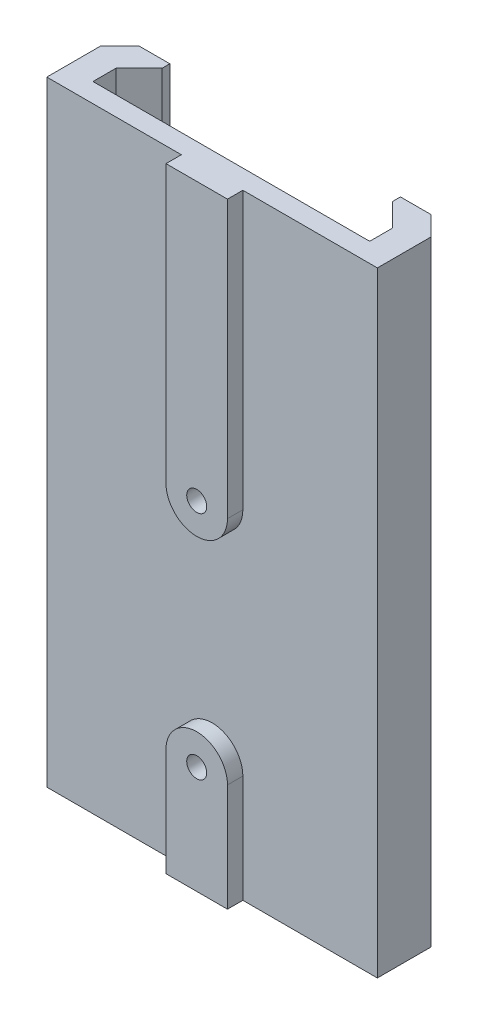
ISO-10303-21;
HEADER;
FILE_DESCRIPTION(('STEP AP214'),'2;1');
FILE_NAME('part.step','',(''),(''),'','','');
FILE_SCHEMA(('AUTOMOTIVE_DESIGN { 1 0 10303 214 1 1 1 1 }'));
ENDSEC;
DATA;
#1=APPLICATION_CONTEXT('core data for automotive mechanical design processes');
#2=APPLICATION_PROTOCOL_DEFINITION('international standard','automotive_design',2000,#1);
#3=PRODUCT_CONTEXT('',#1,'mechanical');
#4=PRODUCT('Part','Part','',(#3));
#5=PRODUCT_RELATED_PRODUCT_CATEGORY('part','',(#4));
#6=PRODUCT_DEFINITION_FORMATION('','',#4);
#7=PRODUCT_DEFINITION_CONTEXT('part definition',#1,'design');
#8=PRODUCT_DEFINITION('design','',#6,#7);
#9=PRODUCT_DEFINITION_SHAPE('','',#8);
#10=(LENGTH_UNIT() NAMED_UNIT(*) SI_UNIT(.MILLI.,.METRE.));
#11=(NAMED_UNIT(*) PLANE_ANGLE_UNIT() SI_UNIT($,.RADIAN.));
#12=(NAMED_UNIT(*) SI_UNIT($,.STERADIAN.) SOLID_ANGLE_UNIT());
#13=UNCERTAINTY_MEASURE_WITH_UNIT(LENGTH_MEASURE(1.E-05),#10,'distance_accuracy_value','');
#14=(GEOMETRIC_REPRESENTATION_CONTEXT(3) GLOBAL_UNCERTAINTY_ASSIGNED_CONTEXT((#13)) GLOBAL_UNIT_ASSIGNED_CONTEXT((#10,
#11,#12)) REPRESENTATION_CONTEXT('',''));
#15=CARTESIAN_POINT('',(0.,0.,0.));
#16=DIRECTION('',(0.,0.,1.));
#17=DIRECTION('',(1.,0.,0.));
#18=AXIS2_PLACEMENT_3D('',#15,#16,#17);
#19=CARTESIAN_POINT('',(21.5,-36.,0.));
#20=DIRECTION('',(0.,0.,1.));
#21=DIRECTION('',(1.,0.,0.));
#22=AXIS2_PLACEMENT_3D('',#19,#20,#21);
#23=CYLINDRICAL_SURFACE('',#22,1.3);
#24=CARTESIAN_POINT('',(21.5,-36.,11.5));
#25=DIRECTION('',(0.,0.,1.));
#26=DIRECTION('',(1.,0.,0.));
#27=AXIS2_PLACEMENT_3D('',#24,#25,#26);
#28=CIRCLE('',#27,1.3);
#29=CARTESIAN_POINT('',(22.8,-36.,11.5));
#30=VERTEX_POINT('',#29);
#31=EDGE_CURVE('E436',#30,#30,#28,.T.);
#32=ORIENTED_EDGE('',*,*,#31,.T.);
#33=EDGE_LOOP('',(#32));
#34=FACE_BOUND('',#33,.T.);
#35=CARTESIAN_POINT('',(21.5,-36.,8.8));
#36=DIRECTION('',(0.,0.,-1.));
#37=DIRECTION('',(-1.,0.,0.));
#38=AXIS2_PLACEMENT_3D('',#35,#36,#37);
#39=CIRCLE('',#38,1.3);
#40=CARTESIAN_POINT('',(20.2,-36.,8.8));
#41=VERTEX_POINT('',#40);
#42=EDGE_CURVE('E304',#41,#41,#39,.F.);
#43=ORIENTED_EDGE('',*,*,#42,.F.);
#44=EDGE_LOOP('',(#43));
#45=FACE_BOUND('',#44,.T.);
#46=ADVANCED_FACE('F37',(#34,#45),#23,.F.);
#47=CARTESIAN_POINT('',(21.5,-66.,0.));
#48=DIRECTION('',(0.,0.,1.));
#49=DIRECTION('',(1.,0.,0.));
#50=AXIS2_PLACEMENT_3D('',#47,#48,#49);
#51=CYLINDRICAL_SURFACE('',#50,1.3);
#52=CARTESIAN_POINT('',(21.5,-66.,11.5));
#53=DIRECTION('',(0.,0.,1.));
#54=DIRECTION('',(1.,0.,0.));
#55=AXIS2_PLACEMENT_3D('',#52,#53,#54);
#56=CIRCLE('',#55,1.3);
#57=CARTESIAN_POINT('',(22.8,-66.,11.5));
#58=VERTEX_POINT('',#57);
#59=EDGE_CURVE('E307',#58,#58,#56,.T.);
#60=ORIENTED_EDGE('',*,*,#59,.T.);
#61=EDGE_LOOP('',(#60));
#62=FACE_BOUND('',#61,.T.);
#63=CARTESIAN_POINT('',(21.5,-66.,8.8));
#64=DIRECTION('',(0.,0.,-1.));
#65=DIRECTION('',(-1.,0.,0.));
#66=AXIS2_PLACEMENT_3D('',#63,#64,#65);
#67=CIRCLE('',#66,1.3);
#68=CARTESIAN_POINT('',(20.2,-66.,8.8));
#69=VERTEX_POINT('',#68);
#70=EDGE_CURVE('E301',#69,#69,#67,.F.);
#71=ORIENTED_EDGE('',*,*,#70,.F.);
#72=EDGE_LOOP('',(#71));
#73=FACE_BOUND('',#72,.T.);
#74=ADVANCED_FACE('F519',(#62,#73),#51,.F.);
#75=CARTESIAN_POINT('',(0.,0.,9.5));
#76=DIRECTION('',(0.,0.,1.));
#77=DIRECTION('',(1.,0.,0.));
#78=AXIS2_PLACEMENT_3D('',#75,#76,#77);
#79=PLANE('',#78);
#80=DIRECTION('',(-1.,0.,0.));
#81=VECTOR('',#80,1.);
#82=CARTESIAN_POINT('',(0.,0.,9.5));
#83=LINE('',#82,#81);
#84=CARTESIAN_POINT('',(43.,0.,9.5));
#85=VERTEX_POINT('',#84);
#86=CARTESIAN_POINT('',(25.5,0.,9.5));
#87=VERTEX_POINT('',#86);
#88=EDGE_CURVE('E264',#85,#87,#83,.T.);
#89=ORIENTED_EDGE('',*,*,#88,.T.);
#90=DIRECTION('',(0.,1.,0.));
#91=VECTOR('',#90,1.);
#92=CARTESIAN_POINT('',(25.5,0.,9.5));
#93=LINE('',#92,#91);
#94=CARTESIAN_POINT('',(25.5,-36.,9.5));
#95=VERTEX_POINT('',#94);
#96=EDGE_CURVE('E431',#95,#87,#93,.T.);
#97=ORIENTED_EDGE('',*,*,#96,.F.);
#98=CARTESIAN_POINT('',(21.5,-36.,9.5));
#99=DIRECTION('',(0.,0.,1.));
#100=DIRECTION('',(1.,0.,0.));
#101=AXIS2_PLACEMENT_3D('',#98,#99,#100);
#102=CIRCLE('',#101,4.);
#103=CARTESIAN_POINT('',(17.5,-36.,9.5));
#104=VERTEX_POINT('',#103);
#105=EDGE_CURVE('E433',#104,#95,#102,.T.);
#106=ORIENTED_EDGE('',*,*,#105,.F.);
#107=DIRECTION('',(0.,-1.,0.));
#108=VECTOR('',#107,1.);
#109=CARTESIAN_POINT('',(17.5,-36.,9.5));
#110=LINE('',#109,#108);
#111=CARTESIAN_POINT('',(17.5,0.,9.5));
#112=VERTEX_POINT('',#111);
#113=EDGE_CURVE('E428',#112,#104,#110,.T.);
#114=ORIENTED_EDGE('',*,*,#113,.F.);
#115=CARTESIAN_POINT('',(0.,0.,9.5));
#116=VERTEX_POINT('',#115);
#117=EDGE_CURVE('E263',#112,#116,#83,.T.);
#118=ORIENTED_EDGE('',*,*,#117,.T.);
#119=DIRECTION('',(0.,-1.,0.));
#120=VECTOR('',#119,1.);
#121=CARTESIAN_POINT('',(0.,0.,9.5));
#122=LINE('',#121,#120);
#123=CARTESIAN_POINT('',(0.,-80.,9.5));
#124=VERTEX_POINT('',#123);
#125=EDGE_CURVE('E254',#116,#124,#122,.T.);
#126=ORIENTED_EDGE('',*,*,#125,.T.);
#127=DIRECTION('',(1.,0.,0.));
#128=VECTOR('',#127,1.);
#129=CARTESIAN_POINT('',(0.,-80.,9.5));
#130=LINE('',#129,#128);
#131=CARTESIAN_POINT('',(17.5,-80.,9.5));
#132=VERTEX_POINT('',#131);
#133=EDGE_CURVE('E259',#124,#132,#130,.T.);
#134=ORIENTED_EDGE('',*,*,#133,.T.);
#135=DIRECTION('',(0.,-1.,0.));
#136=VECTOR('',#135,1.);
#137=CARTESIAN_POINT('',(17.5,-66.,9.5));
#138=LINE('',#137,#136);
#139=CARTESIAN_POINT('',(17.5,-66.,9.5));
#140=VERTEX_POINT('',#139);
#141=EDGE_CURVE('E408',#140,#132,#138,.T.);
#142=ORIENTED_EDGE('',*,*,#141,.F.);
#143=CARTESIAN_POINT('',(21.5,-66.,9.5));
#144=DIRECTION('',(0.,0.,1.));
#145=DIRECTION('',(-1.,0.,0.));
#146=AXIS2_PLACEMENT_3D('',#143,#144,#145);
#147=CIRCLE('',#146,4.);
#148=CARTESIAN_POINT('',(25.5,-66.,9.5));
#149=VERTEX_POINT('',#148);
#150=EDGE_CURVE('E401',#149,#140,#147,.T.);
#151=ORIENTED_EDGE('',*,*,#150,.F.);
#152=DIRECTION('',(0.,1.,0.));
#153=VECTOR('',#152,1.);
#154=CARTESIAN_POINT('',(25.5,-66.,9.5));
#155=LINE('',#154,#153);
#156=CARTESIAN_POINT('',(25.5,-80.,9.5));
#157=VERTEX_POINT('',#156);
#158=EDGE_CURVE('E405',#157,#149,#155,.T.);
#159=ORIENTED_EDGE('',*,*,#158,.F.);
#160=CARTESIAN_POINT('',(43.,-80.,9.5));
#161=VERTEX_POINT('',#160);
#162=EDGE_CURVE('E257',#157,#161,#130,.T.);
#163=ORIENTED_EDGE('',*,*,#162,.T.);
#164=DIRECTION('',(0.,1.,0.));
#165=VECTOR('',#164,1.);
#166=CARTESIAN_POINT('',(43.,0.,9.5));
#167=LINE('',#166,#165);
#168=EDGE_CURVE('E261',#161,#85,#167,.T.);
#169=ORIENTED_EDGE('',*,*,#168,.T.);
#170=EDGE_LOOP('',(#89,#97,#106,#114,#118,#126,#134,#142,#151,#159,#163,#169));
#171=FACE_BOUND('',#170,.T.);
#172=ADVANCED_FACE('F525',(#171),#79,.T.);
#173=CARTESIAN_POINT('',(0.,0.,0.));
#174=DIRECTION('',(0.,0.,1.));
#175=DIRECTION('',(1.,0.,0.));
#176=AXIS2_PLACEMENT_3D('',#173,#174,#175);
#177=PLANE('',#176);
#178=DIRECTION('',(-1.,0.,0.));
#179=VECTOR('',#178,1.);
#180=CARTESIAN_POINT('',(0.,0.,0.));
#181=LINE('',#180,#179);
#182=CARTESIAN_POINT('',(40.5,0.,0.));
#183=VERTEX_POINT('',#182);
#184=CARTESIAN_POINT('',(36.5,0.,0.));
#185=VERTEX_POINT('',#184);
#186=EDGE_CURVE('E258',#183,#185,#181,.T.);
#187=ORIENTED_EDGE('',*,*,#186,.F.);
#188=DIRECTION('',(0.,-1.,0.));
#189=VECTOR('',#188,1.);
#190=CARTESIAN_POINT('',(40.5,0.,0.));
#191=LINE('',#190,#189);
#192=CARTESIAN_POINT('',(40.5,-80.,0.));
#193=VERTEX_POINT('',#192);
#194=EDGE_CURVE('E291',#183,#193,#191,.T.);
#195=ORIENTED_EDGE('',*,*,#194,.T.);
#196=DIRECTION('',(1.,0.,0.));
#197=VECTOR('',#196,1.);
#198=CARTESIAN_POINT('',(0.,-80.,0.));
#199=LINE('',#198,#197);
#200=CARTESIAN_POINT('',(36.5,-80.,0.));
#201=VERTEX_POINT('',#200);
#202=EDGE_CURVE('E271',#201,#193,#199,.T.);
#203=ORIENTED_EDGE('',*,*,#202,.F.);
#204=DIRECTION('',(0.,1.,0.));
#205=VECTOR('',#204,1.);
#206=CARTESIAN_POINT('',(36.5,-80.,0.));
#207=LINE('',#206,#205);
#208=EDGE_CURVE('E349',#201,#185,#207,.T.);
#209=ORIENTED_EDGE('',*,*,#208,.T.);
#210=EDGE_LOOP('',(#187,#195,#203,#209));
#211=FACE_BOUND('',#210,.T.);
#212=ADVANCED_FACE('F483',(#211),#177,.F.);
#213=CARTESIAN_POINT('',(0.,0.,9.5));
#214=DIRECTION('',(1.,0.,0.));
#215=DIRECTION('',(0.,1.,0.));
#216=AXIS2_PLACEMENT_3D('',#213,#214,#215);
#217=PLANE('',#216);
#218=CARTESIAN_POINT('',(0.,-9.99999999999999,5.2));
#219=DIRECTION('',(-1.,0.,0.));
#220=DIRECTION('',(0.,-1.,0.));
#221=AXIS2_PLACEMENT_3D('',#218,#219,#220);
#222=CIRCLE('',#221,1.25);
#223=CARTESIAN_POINT('',(0.,-11.25,5.2));
#224=VERTEX_POINT('',#223);
#225=EDGE_CURVE('E234',#224,#224,#222,.T.);
#226=ORIENTED_EDGE('',*,*,#225,.F.);
#227=EDGE_LOOP('',(#226));
#228=FACE_BOUND('',#227,.T.);
#229=CARTESIAN_POINT('',(0.,-25.,5.20000000000016));
#230=DIRECTION('',(-1.,0.,0.));
#231=DIRECTION('',(0.,-1.,0.));
#232=AXIS2_PLACEMENT_3D('',#229,#230,#231);
#233=CIRCLE('',#232,1.25);
#234=CARTESIAN_POINT('',(0.,-26.25,5.20000000000016));
#235=VERTEX_POINT('',#234);
#236=EDGE_CURVE('E472',#235,#235,#233,.T.);
#237=ORIENTED_EDGE('',*,*,#236,.F.);
#238=EDGE_LOOP('',(#237));
#239=FACE_BOUND('',#238,.T.);
#240=CARTESIAN_POINT('',(0.,-40.,5.20000000000031));
#241=DIRECTION('',(-1.,0.,0.));
#242=DIRECTION('',(0.,-1.,0.));
#243=AXIS2_PLACEMENT_3D('',#240,#241,#242);
#244=CIRCLE('',#243,1.25);
#245=CARTESIAN_POINT('',(0.,-41.25,5.20000000000031));
#246=VERTEX_POINT('',#245);
#247=EDGE_CURVE('E469',#246,#246,#244,.T.);
#248=ORIENTED_EDGE('',*,*,#247,.F.);
#249=EDGE_LOOP('',(#248));
#250=FACE_BOUND('',#249,.T.);
#251=CARTESIAN_POINT('',(0.,-55.,5.20000000000047));
#252=DIRECTION('',(-1.,0.,0.));
#253=DIRECTION('',(0.,-1.,0.));
#254=AXIS2_PLACEMENT_3D('',#251,#252,#253);
#255=CIRCLE('',#254,1.25);
#256=CARTESIAN_POINT('',(0.,-56.25,5.20000000000047));
#257=VERTEX_POINT('',#256);
#258=EDGE_CURVE('E466',#257,#257,#255,.T.);
#259=ORIENTED_EDGE('',*,*,#258,.F.);
#260=EDGE_LOOP('',(#259));
#261=FACE_BOUND('',#260,.T.);
#262=CARTESIAN_POINT('',(0.,-70.,5.20000000000062));
#263=DIRECTION('',(-1.,0.,0.));
#264=DIRECTION('',(0.,-1.,0.));
#265=AXIS2_PLACEMENT_3D('',#262,#263,#264);
#266=CIRCLE('',#265,1.25);
#267=CARTESIAN_POINT('',(0.,-71.25,5.20000000000062));
#268=VERTEX_POINT('',#267);
#269=EDGE_CURVE('E463',#268,#268,#266,.T.);
#270=ORIENTED_EDGE('',*,*,#269,.F.);
#271=EDGE_LOOP('',(#270));
#272=FACE_BOUND('',#271,.T.);
#273=DIRECTION('',(0.,0.,-1.));
#274=VECTOR('',#273,1.);
#275=CARTESIAN_POINT('',(0.,0.,9.5));
#276=LINE('',#275,#274);
#277=CARTESIAN_POINT('',(0.,0.,2.50000000000002));
#278=VERTEX_POINT('',#277);
#279=EDGE_CURVE('E267',#116,#278,#276,.T.);
#280=ORIENTED_EDGE('',*,*,#279,.T.);
#281=DIRECTION('',(0.,-1.,0.));
#282=VECTOR('',#281,1.);
#283=CARTESIAN_POINT('',(0.,0.,2.50000000000002));
#284=LINE('',#283,#282);
#285=CARTESIAN_POINT('',(0.,-80.,2.50000000000002));
#286=VERTEX_POINT('',#285);
#287=EDGE_CURVE('E297',#278,#286,#284,.T.);
#288=ORIENTED_EDGE('',*,*,#287,.T.);
#289=DIRECTION('',(0.,0.,-1.));
#290=VECTOR('',#289,1.);
#291=CARTESIAN_POINT('',(0.,-80.,9.5));
#292=LINE('',#291,#290);
#293=EDGE_CURVE('E281',#124,#286,#292,.T.);
#294=ORIENTED_EDGE('',*,*,#293,.F.);
#295=ORIENTED_EDGE('',*,*,#125,.F.);
#296=EDGE_LOOP('',(#280,#288,#294,#295));
#297=FACE_BOUND('',#296,.T.);
#298=ADVANCED_FACE('F480',(#228,#239,#250,#261,#272,#297),#217,.F.);
#299=CARTESIAN_POINT('',(0.,-80.,9.5));
#300=DIRECTION('',(0.,1.,0.));
#301=DIRECTION('',(0.,0.,1.));
#302=AXIS2_PLACEMENT_3D('',#299,#300,#301);
#303=PLANE('',#302);
#304=ORIENTED_EDGE('',*,*,#202,.T.);
#305=DIRECTION('',(-0.707106781186549,0.,-0.707106781186546));
#306=VECTOR('',#305,1.);
#307=CARTESIAN_POINT('',(43.,-80.,2.49999999999998));
#308=LINE('',#307,#306);
#309=CARTESIAN_POINT('',(43.,-80.,2.49999999999999));
#310=VERTEX_POINT('',#309);
#311=EDGE_CURVE('E295',#193,#310,#308,.F.);
#312=ORIENTED_EDGE('',*,*,#311,.T.);
#313=DIRECTION('',(0.,0.,-1.));
#314=VECTOR('',#313,1.);
#315=CARTESIAN_POINT('',(43.,-80.,9.5));
#316=LINE('',#315,#314);
#317=EDGE_CURVE('E278',#161,#310,#316,.T.);
#318=ORIENTED_EDGE('',*,*,#317,.F.);
#319=ORIENTED_EDGE('',*,*,#162,.F.);
#320=DIRECTION('',(0.,0.,-1.));
#321=VECTOR('',#320,1.);
#322=CARTESIAN_POINT('',(25.5,-80.,11.5));
#323=LINE('',#322,#321);
#324=CARTESIAN_POINT('',(25.5,-80.,11.5));
#325=VERTEX_POINT('',#324);
#326=EDGE_CURVE('E388',#325,#157,#323,.T.);
#327=ORIENTED_EDGE('',*,*,#326,.F.);
#328=DIRECTION('',(1.,0.,0.));
#329=VECTOR('',#328,1.);
#330=CARTESIAN_POINT('',(17.5,-80.,11.5));
#331=LINE('',#330,#329);
#332=CARTESIAN_POINT('',(17.5,-80.,11.5));
#333=VERTEX_POINT('',#332);
#334=EDGE_CURVE('E414',#333,#325,#331,.T.);
#335=ORIENTED_EDGE('',*,*,#334,.F.);
#336=DIRECTION('',(0.,0.,-1.));
#337=VECTOR('',#336,1.);
#338=CARTESIAN_POINT('',(17.5,-80.,11.5));
#339=LINE('',#338,#337);
#340=EDGE_CURVE('E385',#333,#132,#339,.T.);
#341=ORIENTED_EDGE('',*,*,#340,.T.);
#342=ORIENTED_EDGE('',*,*,#133,.F.);
#343=ORIENTED_EDGE('',*,*,#293,.T.);
#344=DIRECTION('',(-0.707106781186548,0.,0.707106781186548));
#345=VECTOR('',#344,1.);
#346=CARTESIAN_POINT('',(0.,-80.,2.50000000000002));
#347=LINE('',#346,#345);
#348=CARTESIAN_POINT('',(2.50000000000003,-80.,0.));
#349=VERTEX_POINT('',#348);
#350=EDGE_CURVE('E293',#286,#349,#347,.F.);
#351=ORIENTED_EDGE('',*,*,#350,.T.);
#352=CARTESIAN_POINT('',(6.5,-80.,0.));
#353=VERTEX_POINT('',#352);
#354=EDGE_CURVE('E268',#349,#353,#199,.T.);
#355=ORIENTED_EDGE('',*,*,#354,.T.);
#356=DIRECTION('',(0.,0.,1.));
#357=VECTOR('',#356,1.);
#358=CARTESIAN_POINT('',(6.5,-80.,0.));
#359=LINE('',#358,#357);
#360=CARTESIAN_POINT('',(6.5,-80.,1.00000000000001));
#361=VERTEX_POINT('',#360);
#362=EDGE_CURVE('E348',#353,#361,#359,.T.);
#363=ORIENTED_EDGE('',*,*,#362,.T.);
#364=DIRECTION('',(-0.707106781186548,0.,0.707106781186547));
#365=VECTOR('',#364,1.);
#366=CARTESIAN_POINT('',(6.5,-80.,1.00000000000001));
#367=LINE('',#366,#365);
#368=CARTESIAN_POINT('',(3.5,-80.,4.));
#369=VERTEX_POINT('',#368);
#370=EDGE_CURVE('E367',#361,#369,#367,.T.);
#371=ORIENTED_EDGE('',*,*,#370,.T.);
#372=DIRECTION('',(0.,0.,1.));
#373=VECTOR('',#372,1.);
#374=CARTESIAN_POINT('',(3.5,-80.,4.));
#375=LINE('',#374,#373);
#376=CARTESIAN_POINT('',(3.5,-80.,7.));
#377=VERTEX_POINT('',#376);
#378=EDGE_CURVE('E364',#369,#377,#375,.T.);
#379=ORIENTED_EDGE('',*,*,#378,.T.);
#380=DIRECTION('',(1.,0.,0.));
#381=VECTOR('',#380,1.);
#382=CARTESIAN_POINT('',(3.5,-80.,7.));
#383=LINE('',#382,#381);
#384=CARTESIAN_POINT('',(39.5,-80.,7.));
#385=VERTEX_POINT('',#384);
#386=EDGE_CURVE('E362',#377,#385,#383,.T.);
#387=ORIENTED_EDGE('',*,*,#386,.T.);
#388=DIRECTION('',(0.,0.,-1.));
#389=VECTOR('',#388,1.);
#390=CARTESIAN_POINT('',(39.5,-80.,4.));
#391=LINE('',#390,#389);
#392=CARTESIAN_POINT('',(39.5,-80.,4.));
#393=VERTEX_POINT('',#392);
#394=EDGE_CURVE('E378',#385,#393,#391,.T.);
#395=ORIENTED_EDGE('',*,*,#394,.T.);
#396=DIRECTION('',(-0.707106781186547,0.,-0.707106781186548));
#397=VECTOR('',#396,1.);
#398=CARTESIAN_POINT('',(36.5,-80.,1.00000000000001));
#399=LINE('',#398,#397);
#400=CARTESIAN_POINT('',(36.5,-80.,1.00000000000001));
#401=VERTEX_POINT('',#400);
#402=EDGE_CURVE('E381',#393,#401,#399,.T.);
#403=ORIENTED_EDGE('',*,*,#402,.T.);
#404=DIRECTION('',(0.,0.,-1.));
#405=VECTOR('',#404,1.);
#406=CARTESIAN_POINT('',(36.5,-80.,0.));
#407=LINE('',#406,#405);
#408=EDGE_CURVE('E253',#401,#201,#407,.T.);
#409=ORIENTED_EDGE('',*,*,#408,.T.);
#410=EDGE_LOOP('',(#304,#312,#318,#319,#327,#335,#341,#342,#343,#351,#355,#363,#371,#379,#387,
#395,#403,#409));
#411=FACE_BOUND('',#410,.T.);
#412=ADVANCED_FACE('F371',(#411),#303,.F.);
#413=CARTESIAN_POINT('',(43.,0.,9.5));
#414=DIRECTION('',(-1.,0.,0.));
#415=DIRECTION('',(0.,-1.,0.));
#416=AXIS2_PLACEMENT_3D('',#413,#414,#415);
#417=PLANE('',#416);
#418=ORIENTED_EDGE('',*,*,#317,.T.);
#419=DIRECTION('',(0.,1.,0.));
#420=VECTOR('',#419,1.);
#421=CARTESIAN_POINT('',(43.,0.,2.49999999999999));
#422=LINE('',#421,#420);
#423=CARTESIAN_POINT('',(43.,0.,2.49999999999999));
#424=VERTEX_POINT('',#423);
#425=EDGE_CURVE('E284',#310,#424,#422,.T.);
#426=ORIENTED_EDGE('',*,*,#425,.T.);
#427=DIRECTION('',(0.,0.,-1.));
#428=VECTOR('',#427,1.);
#429=CARTESIAN_POINT('',(43.,0.,9.5));
#430=LINE('',#429,#428);
#431=EDGE_CURVE('E275',#85,#424,#430,.T.);
#432=ORIENTED_EDGE('',*,*,#431,.F.);
#433=ORIENTED_EDGE('',*,*,#168,.F.);
#434=EDGE_LOOP('',(#418,#426,#432,#433));
#435=FACE_BOUND('',#434,.T.);
#436=ADVANCED_FACE('F691',(#435),#417,.F.);
#437=CARTESIAN_POINT('',(0.,0.,9.5));
#438=DIRECTION('',(0.,-1.,0.));
#439=DIRECTION('',(0.,0.,-1.));
#440=AXIS2_PLACEMENT_3D('',#437,#438,#439);
#441=PLANE('',#440);
#442=ORIENTED_EDGE('',*,*,#431,.T.);
#443=DIRECTION('',(0.707106781186549,0.,0.707106781186546));
#444=VECTOR('',#443,1.);
#445=CARTESIAN_POINT('',(43.,0.,2.49999999999999));
#446=LINE('',#445,#444);
#447=EDGE_CURVE('E289',#424,#183,#446,.F.);
#448=ORIENTED_EDGE('',*,*,#447,.T.);
#449=ORIENTED_EDGE('',*,*,#186,.T.);
#450=DIRECTION('',(0.,0.,-1.));
#451=VECTOR('',#450,1.);
#452=CARTESIAN_POINT('',(36.5,0.,0.));
#453=LINE('',#452,#451);
#454=CARTESIAN_POINT('',(36.5,0.,1.00000000000001));
#455=VERTEX_POINT('',#454);
#456=EDGE_CURVE('E345',#455,#185,#453,.T.);
#457=ORIENTED_EDGE('',*,*,#456,.F.);
#458=DIRECTION('',(-0.707106781186547,0.,-0.707106781186548));
#459=VECTOR('',#458,1.);
#460=CARTESIAN_POINT('',(36.5,0.,1.00000000000001));
#461=LINE('',#460,#459);
#462=CARTESIAN_POINT('',(39.5,0.,4.));
#463=VERTEX_POINT('',#462);
#464=EDGE_CURVE('E342',#463,#455,#461,.T.);
#465=ORIENTED_EDGE('',*,*,#464,.F.);
#466=DIRECTION('',(0.,0.,-1.));
#467=VECTOR('',#466,1.);
#468=CARTESIAN_POINT('',(39.5,0.,4.));
#469=LINE('',#468,#467);
#470=CARTESIAN_POINT('',(39.5,0.,7.));
#471=VERTEX_POINT('',#470);
#472=EDGE_CURVE('E336',#471,#463,#469,.T.);
#473=ORIENTED_EDGE('',*,*,#472,.F.);
#474=DIRECTION('',(1.,0.,0.));
#475=VECTOR('',#474,1.);
#476=CARTESIAN_POINT('',(3.5,0.,7.));
#477=LINE('',#476,#475);
#478=CARTESIAN_POINT('',(3.5,0.,7.));
#479=VERTEX_POINT('',#478);
#480=EDGE_CURVE('E334',#479,#471,#477,.T.);
#481=ORIENTED_EDGE('',*,*,#480,.F.);
#482=DIRECTION('',(0.,0.,1.));
#483=VECTOR('',#482,1.);
#484=CARTESIAN_POINT('',(3.5,0.,4.));
#485=LINE('',#484,#483);
#486=CARTESIAN_POINT('',(3.5,0.,4.));
#487=VERTEX_POINT('',#486);
#488=EDGE_CURVE('E321',#487,#479,#485,.T.);
#489=ORIENTED_EDGE('',*,*,#488,.F.);
#490=DIRECTION('',(-0.707106781186548,0.,0.707106781186547));
#491=VECTOR('',#490,1.);
#492=CARTESIAN_POINT('',(6.5,0.,1.00000000000001));
#493=LINE('',#492,#491);
#494=CARTESIAN_POINT('',(6.5,0.,1.00000000000001));
#495=VERTEX_POINT('',#494);
#496=EDGE_CURVE('E324',#495,#487,#493,.T.);
#497=ORIENTED_EDGE('',*,*,#496,.F.);
#498=DIRECTION('',(0.,0.,1.));
#499=VECTOR('',#498,1.);
#500=CARTESIAN_POINT('',(6.5,0.,0.));
#501=LINE('',#500,#499);
#502=CARTESIAN_POINT('',(6.5,0.,0.));
#503=VERTEX_POINT('',#502);
#504=EDGE_CURVE('E329',#503,#495,#501,.T.);
#505=ORIENTED_EDGE('',*,*,#504,.F.);
#506=CARTESIAN_POINT('',(2.50000000000002,0.,0.));
#507=VERTEX_POINT('',#506);
#508=EDGE_CURVE('E270',#503,#507,#181,.T.);
#509=ORIENTED_EDGE('',*,*,#508,.T.);
#510=DIRECTION('',(0.707106781186548,0.,-0.707106781186548));
#511=VECTOR('',#510,1.);
#512=CARTESIAN_POINT('',(0.,0.,2.50000000000002));
#513=LINE('',#512,#511);
#514=EDGE_CURVE('E287',#507,#278,#513,.F.);
#515=ORIENTED_EDGE('',*,*,#514,.T.);
#516=ORIENTED_EDGE('',*,*,#279,.F.);
#517=ORIENTED_EDGE('',*,*,#117,.F.);
#518=DIRECTION('',(0.,0.,-1.));
#519=VECTOR('',#518,1.);
#520=CARTESIAN_POINT('',(17.5,0.,11.5));
#521=LINE('',#520,#519);
#522=CARTESIAN_POINT('',(17.5,0.,11.5));
#523=VERTEX_POINT('',#522);
#524=EDGE_CURVE('E422',#523,#112,#521,.T.);
#525=ORIENTED_EDGE('',*,*,#524,.F.);
#526=DIRECTION('',(-1.,0.,0.));
#527=VECTOR('',#526,1.);
#528=CARTESIAN_POINT('',(17.5,0.,11.5));
#529=LINE('',#528,#527);
#530=CARTESIAN_POINT('',(25.5,0.,11.5));
#531=VERTEX_POINT('',#530);
#532=EDGE_CURVE('E438',#531,#523,#529,.T.);
#533=ORIENTED_EDGE('',*,*,#532,.F.);
#534=DIRECTION('',(0.,0.,-1.));
#535=VECTOR('',#534,1.);
#536=CARTESIAN_POINT('',(25.5,0.,11.5));
#537=LINE('',#536,#535);
#538=EDGE_CURVE('E419',#531,#87,#537,.T.);
#539=ORIENTED_EDGE('',*,*,#538,.T.);
#540=ORIENTED_EDGE('',*,*,#88,.F.);
#541=EDGE_LOOP('',(#442,#448,#449,#457,#465,#473,#481,#489,#497,#505,#509,#515,#516,#517,#525,
#533,#539,#540));
#542=FACE_BOUND('',#541,.T.);
#543=ADVANCED_FACE('F331',(#542),#441,.F.);
#544=ORIENTED_EDGE('',*,*,#354,.F.);
#545=DIRECTION('',(0.,1.,0.));
#546=VECTOR('',#545,1.);
#547=CARTESIAN_POINT('',(2.50000000000002,0.,0.));
#548=LINE('',#547,#546);
#549=EDGE_CURVE('E223',#349,#507,#548,.T.);
#550=ORIENTED_EDGE('',*,*,#549,.T.);
#551=ORIENTED_EDGE('',*,*,#508,.F.);
#552=DIRECTION('',(0.,1.,0.));
#553=VECTOR('',#552,1.);
#554=CARTESIAN_POINT('',(6.5,-80.,0.));
#555=LINE('',#554,#553);
#556=EDGE_CURVE('E251',#353,#503,#555,.T.);
#557=ORIENTED_EDGE('',*,*,#556,.F.);
#558=EDGE_LOOP('',(#544,#550,#551,#557));
#559=FACE_BOUND('',#558,.T.);
#560=ADVANCED_FACE('F504',(#559),#177,.F.);
#561=CARTESIAN_POINT('',(36.5,-80.,0.));
#562=DIRECTION('',(1.,0.,0.));
#563=DIRECTION('',(0.,0.,-1.));
#564=AXIS2_PLACEMENT_3D('',#561,#562,#563);
#565=PLANE('',#564);
#566=ORIENTED_EDGE('',*,*,#456,.T.);
#567=ORIENTED_EDGE('',*,*,#208,.F.);
#568=ORIENTED_EDGE('',*,*,#408,.F.);
#569=DIRECTION('',(0.,1.,0.));
#570=VECTOR('',#569,1.);
#571=CARTESIAN_POINT('',(36.5,-80.,1.00000000000001));
#572=LINE('',#571,#570);
#573=EDGE_CURVE('E352',#401,#455,#572,.T.);
#574=ORIENTED_EDGE('',*,*,#573,.T.);
#575=EDGE_LOOP('',(#566,#567,#568,#574));
#576=FACE_BOUND('',#575,.T.);
#577=ADVANCED_FACE('F566',(#576),#565,.F.);
#578=CARTESIAN_POINT('',(36.5,-80.,1.00000000000001));
#579=DIRECTION('',(0.707106781186548,0.,-0.707106781186547));
#580=DIRECTION('',(-0.707106781186547,0.,-0.707106781186548));
#581=AXIS2_PLACEMENT_3D('',#578,#579,#580);
#582=PLANE('',#581);
#583=ORIENTED_EDGE('',*,*,#464,.T.);
#584=ORIENTED_EDGE('',*,*,#573,.F.);
#585=ORIENTED_EDGE('',*,*,#402,.F.);
#586=DIRECTION('',(0.,1.,0.));
#587=VECTOR('',#586,1.);
#588=CARTESIAN_POINT('',(39.5,-80.,4.));
#589=LINE('',#588,#587);
#590=EDGE_CURVE('E354',#393,#463,#589,.T.);
#591=ORIENTED_EDGE('',*,*,#590,.T.);
#592=EDGE_LOOP('',(#583,#584,#585,#591));
#593=FACE_BOUND('',#592,.T.);
#594=ADVANCED_FACE('F569',(#593),#582,.F.);
#595=CARTESIAN_POINT('',(39.5,-80.,4.));
#596=DIRECTION('',(1.,0.,0.));
#597=DIRECTION('',(0.,0.,-1.));
#598=AXIS2_PLACEMENT_3D('',#595,#596,#597);
#599=PLANE('',#598);
#600=ORIENTED_EDGE('',*,*,#472,.T.);
#601=ORIENTED_EDGE('',*,*,#590,.F.);
#602=ORIENTED_EDGE('',*,*,#394,.F.);
#603=DIRECTION('',(0.,1.,0.));
#604=VECTOR('',#603,1.);
#605=CARTESIAN_POINT('',(39.5,-80.,7.));
#606=LINE('',#605,#604);
#607=EDGE_CURVE('E355',#385,#471,#606,.T.);
#608=ORIENTED_EDGE('',*,*,#607,.T.);
#609=EDGE_LOOP('',(#600,#601,#602,#608));
#610=FACE_BOUND('',#609,.T.);
#611=ADVANCED_FACE('F573',(#610),#599,.F.);
#612=CARTESIAN_POINT('',(3.5,-80.,7.));
#613=DIRECTION('',(0.,0.,1.));
#614=DIRECTION('',(1.,0.,0.));
#615=AXIS2_PLACEMENT_3D('',#612,#613,#614);
#616=PLANE('',#615);
#617=CARTESIAN_POINT('',(21.5,-36.,7.));
#618=DIRECTION('',(0.,0.,-1.));
#619=DIRECTION('',(-1.,0.,0.));
#620=AXIS2_PLACEMENT_3D('',#617,#618,#619);
#621=CIRCLE('',#620,2.15);
#622=CARTESIAN_POINT('',(19.35,-36.,7.));
#623=VERTEX_POINT('',#622);
#624=EDGE_CURVE('E454',#623,#623,#621,.T.);
#625=ORIENTED_EDGE('',*,*,#624,.F.);
#626=EDGE_LOOP('',(#625));
#627=FACE_BOUND('',#626,.T.);
#628=CARTESIAN_POINT('',(21.5,-66.,7.));
#629=DIRECTION('',(0.,0.,-1.));
#630=DIRECTION('',(-1.,0.,0.));
#631=AXIS2_PLACEMENT_3D('',#628,#629,#630);
#632=CIRCLE('',#631,2.15);
#633=CARTESIAN_POINT('',(19.35,-66.,7.));
#634=VERTEX_POINT('',#633);
#635=EDGE_CURVE('E448',#634,#634,#632,.T.);
#636=ORIENTED_EDGE('',*,*,#635,.F.);
#637=EDGE_LOOP('',(#636));
#638=FACE_BOUND('',#637,.T.);
#639=ORIENTED_EDGE('',*,*,#480,.T.);
#640=ORIENTED_EDGE('',*,*,#607,.F.);
#641=ORIENTED_EDGE('',*,*,#386,.F.);
#642=DIRECTION('',(0.,1.,0.));
#643=VECTOR('',#642,1.);
#644=CARTESIAN_POINT('',(3.5,-80.,7.));
#645=LINE('',#644,#643);
#646=EDGE_CURVE('E242',#377,#479,#645,.T.);
#647=ORIENTED_EDGE('',*,*,#646,.T.);
#648=EDGE_LOOP('',(#639,#640,#641,#647));
#649=FACE_BOUND('',#648,.T.);
#650=ADVANCED_FACE('F360',(#627,#638,#649),#616,.F.);
#651=CARTESIAN_POINT('',(3.5,-80.,4.));
#652=DIRECTION('',(-1.,0.,0.));
#653=DIRECTION('',(0.,0.,1.));
#654=AXIS2_PLACEMENT_3D('',#651,#652,#653);
#655=PLANE('',#654);
#656=DIRECTION('',(0.,1.,0.));
#657=VECTOR('',#656,1.);
#658=CARTESIAN_POINT('',(3.5,-80.,4.));
#659=LINE('',#658,#657);
#660=CARTESIAN_POINT('',(3.5,-24.6500000000005,4.));
#661=VERTEX_POINT('',#660);
#662=CARTESIAN_POINT('',(3.5,-10.35,4.));
#663=VERTEX_POINT('',#662);
#664=EDGE_CURVE('E315',#661,#663,#659,.T.);
#665=ORIENTED_EDGE('',*,*,#664,.T.);
#666=CARTESIAN_POINT('',(3.5,-9.99999999999999,5.2));
#667=DIRECTION('',(-1.,0.,0.));
#668=DIRECTION('',(0.,0.,1.));
#669=AXIS2_PLACEMENT_3D('',#666,#667,#668);
#670=CIRCLE('',#669,1.25);
#671=CARTESIAN_POINT('',(3.5,-9.64999999999999,4.));
#672=VERTEX_POINT('',#671);
#673=EDGE_CURVE('E52',#663,#672,#670,.T.);
#674=ORIENTED_EDGE('',*,*,#673,.T.);
#675=EDGE_CURVE('E243',#672,#487,#659,.T.);
#676=ORIENTED_EDGE('',*,*,#675,.T.);
#677=ORIENTED_EDGE('',*,*,#488,.T.);
#678=ORIENTED_EDGE('',*,*,#646,.F.);
#679=ORIENTED_EDGE('',*,*,#378,.F.);
#680=CARTESIAN_POINT('',(3.5,-70.3499999999979,4.));
#681=VERTEX_POINT('',#680);
#682=EDGE_CURVE('E232',#369,#681,#659,.T.);
#683=ORIENTED_EDGE('',*,*,#682,.T.);
#684=CARTESIAN_POINT('',(3.5,-70.,5.20000000000062));
#685=DIRECTION('',(-1.,0.,0.));
#686=DIRECTION('',(0.,0.,1.));
#687=AXIS2_PLACEMENT_3D('',#684,#685,#686);
#688=CIRCLE('',#687,1.25);
#689=CARTESIAN_POINT('',(3.5,-69.6500000000021,4.));
#690=VERTEX_POINT('',#689);
#691=EDGE_CURVE('E218',#681,#690,#688,.T.);
#692=ORIENTED_EDGE('',*,*,#691,.T.);
#693=CARTESIAN_POINT('',(3.5,-55.3499999999984,4.));
#694=VERTEX_POINT('',#693);
#695=EDGE_CURVE('E230',#690,#694,#659,.T.);
#696=ORIENTED_EDGE('',*,*,#695,.T.);
#697=CARTESIAN_POINT('',(3.5,-55.,5.20000000000047));
#698=DIRECTION('',(-1.,0.,0.));
#699=DIRECTION('',(0.,0.,1.));
#700=AXIS2_PLACEMENT_3D('',#697,#698,#699);
#701=CIRCLE('',#700,1.25);
#702=CARTESIAN_POINT('',(3.5,-54.6500000000016,4.));
#703=VERTEX_POINT('',#702);
#704=EDGE_CURVE('E233',#694,#703,#701,.T.);
#705=ORIENTED_EDGE('',*,*,#704,.T.);
#706=CARTESIAN_POINT('',(3.5,-40.3499999999989,4.));
#707=VERTEX_POINT('',#706);
#708=EDGE_CURVE('E240',#703,#707,#659,.T.);
#709=ORIENTED_EDGE('',*,*,#708,.T.);
#710=CARTESIAN_POINT('',(3.5,-40.,5.20000000000031));
#711=DIRECTION('',(-1.,0.,0.));
#712=DIRECTION('',(0.,0.,1.));
#713=AXIS2_PLACEMENT_3D('',#710,#711,#712);
#714=CIRCLE('',#713,1.25);
#715=CARTESIAN_POINT('',(3.5,-39.6500000000011,4.));
#716=VERTEX_POINT('',#715);
#717=EDGE_CURVE('E317',#707,#716,#714,.T.);
#718=ORIENTED_EDGE('',*,*,#717,.T.);
#719=CARTESIAN_POINT('',(3.5,-25.3499999999995,4.));
#720=VERTEX_POINT('',#719);
#721=EDGE_CURVE('E245',#716,#720,#659,.T.);
#722=ORIENTED_EDGE('',*,*,#721,.T.);
#723=CARTESIAN_POINT('',(3.5,-25.,5.20000000000016));
#724=DIRECTION('',(-1.,0.,0.));
#725=DIRECTION('',(0.,0.,1.));
#726=AXIS2_PLACEMENT_3D('',#723,#724,#725);
#727=CIRCLE('',#726,1.25);
#728=EDGE_CURVE('E58',#720,#661,#727,.T.);
#729=ORIENTED_EDGE('',*,*,#728,.T.);
#730=EDGE_LOOP('',(#665,#674,#676,#677,#678,#679,#683,#692,#696,#705,#709,#718,#722,#729));
#731=FACE_BOUND('',#730,.T.);
#732=ADVANCED_FACE('F228',(#731),#655,.F.);
#733=CARTESIAN_POINT('',(6.5,-80.,1.00000000000001));
#734=DIRECTION('',(-0.707106781186547,0.,-0.707106781186548));
#735=DIRECTION('',(-0.707106781186548,0.,0.707106781186547));
#736=AXIS2_PLACEMENT_3D('',#733,#734,#735);
#737=PLANE('',#736);
#738=ORIENTED_EDGE('',*,*,#675,.F.);
#739=CARTESIAN_POINT('',(2.3,-9.99999999999999,5.2));
#740=DIRECTION('',(-0.707106781186547,0.,-0.707106781186548));
#741=DIRECTION('',(-0.707106781186548,0.,0.707106781186547));
#742=AXIS2_PLACEMENT_3D('',#739,#740,#741);
#743=ELLIPSE('',#742,1.76776695296637,1.25);
#744=EDGE_CURVE('E11',#672,#663,#743,.T.);
#745=ORIENTED_EDGE('',*,*,#744,.T.);
#746=ORIENTED_EDGE('',*,*,#664,.F.);
#747=CARTESIAN_POINT('',(2.29999999999985,-25.,5.20000000000016));
#748=DIRECTION('',(-0.707106781186547,0.,-0.707106781186548));
#749=DIRECTION('',(-0.707106781186548,0.,0.707106781186547));
#750=AXIS2_PLACEMENT_3D('',#747,#748,#749);
#751=ELLIPSE('',#750,1.76776695296637,1.25);
#752=EDGE_CURVE('E46',#661,#720,#751,.T.);
#753=ORIENTED_EDGE('',*,*,#752,.T.);
#754=ORIENTED_EDGE('',*,*,#721,.F.);
#755=CARTESIAN_POINT('',(2.29999999999969,-40.,5.20000000000031));
#756=DIRECTION('',(-0.707106781186547,0.,-0.707106781186548));
#757=DIRECTION('',(-0.707106781186548,0.,0.707106781186547));
#758=AXIS2_PLACEMENT_3D('',#755,#756,#757);
#759=ELLIPSE('',#758,1.76776695296637,1.25);
#760=EDGE_CURVE('E310',#716,#707,#759,.T.);
#761=ORIENTED_EDGE('',*,*,#760,.T.);
#762=ORIENTED_EDGE('',*,*,#708,.F.);
#763=CARTESIAN_POINT('',(2.29999999999953,-55.,5.20000000000047));
#764=DIRECTION('',(-0.707106781186547,0.,-0.707106781186548));
#765=DIRECTION('',(-0.707106781186548,0.,0.707106781186547));
#766=AXIS2_PLACEMENT_3D('',#763,#764,#765);
#767=ELLIPSE('',#766,1.76776695296637,1.25);
#768=EDGE_CURVE('E222',#703,#694,#767,.T.);
#769=ORIENTED_EDGE('',*,*,#768,.T.);
#770=ORIENTED_EDGE('',*,*,#695,.F.);
#771=CARTESIAN_POINT('',(2.29999999999938,-70.,5.20000000000062));
#772=DIRECTION('',(-0.707106781186547,0.,-0.707106781186548));
#773=DIRECTION('',(-0.707106781186548,0.,0.707106781186547));
#774=AXIS2_PLACEMENT_3D('',#771,#772,#773);
#775=ELLIPSE('',#774,1.76776695296637,1.25);
#776=EDGE_CURVE('E215',#690,#681,#775,.T.);
#777=ORIENTED_EDGE('',*,*,#776,.T.);
#778=ORIENTED_EDGE('',*,*,#682,.F.);
#779=ORIENTED_EDGE('',*,*,#370,.F.);
#780=DIRECTION('',(0.,1.,0.));
#781=VECTOR('',#780,1.);
#782=CARTESIAN_POINT('',(6.5,-80.,1.00000000000001));
#783=LINE('',#782,#781);
#784=EDGE_CURVE('E249',#361,#495,#783,.T.);
#785=ORIENTED_EDGE('',*,*,#784,.T.);
#786=ORIENTED_EDGE('',*,*,#496,.T.);
#787=EDGE_LOOP('',(#738,#745,#746,#753,#754,#761,#762,#769,#770,#777,#778,#779,#785,#786));
#788=FACE_BOUND('',#787,.T.);
#789=ADVANCED_FACE('F238',(#788),#737,.F.);
#790=CARTESIAN_POINT('',(6.5,-80.,0.));
#791=DIRECTION('',(-1.,0.,0.));
#792=DIRECTION('',(0.,0.,1.));
#793=AXIS2_PLACEMENT_3D('',#790,#791,#792);
#794=PLANE('',#793);
#795=ORIENTED_EDGE('',*,*,#504,.T.);
#796=ORIENTED_EDGE('',*,*,#784,.F.);
#797=ORIENTED_EDGE('',*,*,#362,.F.);
#798=ORIENTED_EDGE('',*,*,#556,.T.);
#799=EDGE_LOOP('',(#795,#796,#797,#798));
#800=FACE_BOUND('',#799,.T.);
#801=ADVANCED_FACE('F507',(#800),#794,.F.);
#802=CARTESIAN_POINT('',(43.,0.,2.49999999999999));
#803=DIRECTION('',(-0.707106781186546,0.,0.707106781186549));
#804=DIRECTION('',(0.,1.,0.));
#805=AXIS2_PLACEMENT_3D('',#802,#803,#804);
#806=PLANE('',#805);
#807=ORIENTED_EDGE('',*,*,#311,.F.);
#808=ORIENTED_EDGE('',*,*,#194,.F.);
#809=ORIENTED_EDGE('',*,*,#447,.F.);
#810=ORIENTED_EDGE('',*,*,#425,.F.);
#811=EDGE_LOOP('',(#807,#808,#809,#810));
#812=FACE_BOUND('',#811,.T.);
#813=ADVANCED_FACE('F509',(#812),#806,.F.);
#814=CARTESIAN_POINT('',(0.,0.,2.50000000000002));
#815=DIRECTION('',(0.707106781186547,0.,0.707106781186547));
#816=DIRECTION('',(0.,-1.,0.));
#817=AXIS2_PLACEMENT_3D('',#814,#815,#816);
#818=PLANE('',#817);
#819=ORIENTED_EDGE('',*,*,#514,.F.);
#820=ORIENTED_EDGE('',*,*,#549,.F.);
#821=ORIENTED_EDGE('',*,*,#350,.F.);
#822=ORIENTED_EDGE('',*,*,#287,.F.);
#823=EDGE_LOOP('',(#819,#820,#821,#822));
#824=FACE_BOUND('',#823,.T.);
#825=ADVANCED_FACE('F40',(#824),#818,.F.);
#826=CARTESIAN_POINT('',(17.5,-66.,11.5));
#827=DIRECTION('',(1.,0.,0.));
#828=DIRECTION('',(0.,1.,0.));
#829=AXIS2_PLACEMENT_3D('',#826,#827,#828);
#830=PLANE('',#829);
#831=ORIENTED_EDGE('',*,*,#141,.T.);
#832=ORIENTED_EDGE('',*,*,#340,.F.);
#833=DIRECTION('',(0.,-1.,0.));
#834=VECTOR('',#833,1.);
#835=CARTESIAN_POINT('',(17.5,-66.,11.5));
#836=LINE('',#835,#834);
#837=CARTESIAN_POINT('',(17.5,-66.,11.5));
#838=VERTEX_POINT('',#837);
#839=EDGE_CURVE('E404',#838,#333,#836,.T.);
#840=ORIENTED_EDGE('',*,*,#839,.F.);
#841=DIRECTION('',(0.,0.,-1.));
#842=VECTOR('',#841,1.);
#843=CARTESIAN_POINT('',(17.5,-66.,11.5));
#844=LINE('',#843,#842);
#845=EDGE_CURVE('E397',#838,#140,#844,.T.);
#846=ORIENTED_EDGE('',*,*,#845,.T.);
#847=EDGE_LOOP('',(#831,#832,#840,#846));
#848=FACE_BOUND('',#847,.T.);
#849=ADVANCED_FACE('F561',(#848),#830,.F.);
#850=CARTESIAN_POINT('',(25.5,-66.,11.5));
#851=DIRECTION('',(-1.,0.,0.));
#852=DIRECTION('',(0.,-1.,0.));
#853=AXIS2_PLACEMENT_3D('',#850,#851,#852);
#854=PLANE('',#853);
#855=ORIENTED_EDGE('',*,*,#158,.T.);
#856=DIRECTION('',(0.,0.,-1.));
#857=VECTOR('',#856,1.);
#858=CARTESIAN_POINT('',(25.5,-66.,11.5));
#859=LINE('',#858,#857);
#860=CARTESIAN_POINT('',(25.5,-66.,11.5));
#861=VERTEX_POINT('',#860);
#862=EDGE_CURVE('E392',#861,#149,#859,.T.);
#863=ORIENTED_EDGE('',*,*,#862,.F.);
#864=DIRECTION('',(0.,1.,0.));
#865=VECTOR('',#864,1.);
#866=CARTESIAN_POINT('',(25.5,-66.,11.5));
#867=LINE('',#866,#865);
#868=EDGE_CURVE('E412',#325,#861,#867,.T.);
#869=ORIENTED_EDGE('',*,*,#868,.F.);
#870=ORIENTED_EDGE('',*,*,#326,.T.);
#871=EDGE_LOOP('',(#855,#863,#869,#870));
#872=FACE_BOUND('',#871,.T.);
#873=ADVANCED_FACE('F557',(#872),#854,.F.);
#874=CARTESIAN_POINT('',(21.5,-66.,11.5));
#875=DIRECTION('',(0.,0.,-1.));
#876=DIRECTION('',(-1.,0.,0.));
#877=AXIS2_PLACEMENT_3D('',#874,#875,#876);
#878=CYLINDRICAL_SURFACE('',#877,4.);
#879=ORIENTED_EDGE('',*,*,#150,.T.);
#880=ORIENTED_EDGE('',*,*,#845,.F.);
#881=CARTESIAN_POINT('',(21.5,-66.,11.5));
#882=DIRECTION('',(0.,0.,1.));
#883=DIRECTION('',(-1.,0.,0.));
#884=AXIS2_PLACEMENT_3D('',#881,#882,#883);
#885=CIRCLE('',#884,4.);
#886=EDGE_CURVE('E400',#861,#838,#885,.T.);
#887=ORIENTED_EDGE('',*,*,#886,.F.);
#888=ORIENTED_EDGE('',*,*,#862,.T.);
#889=EDGE_LOOP('',(#879,#880,#887,#888));
#890=FACE_BOUND('',#889,.T.);
#891=ADVANCED_FACE('F553',(#890),#878,.T.);
#892=CARTESIAN_POINT('',(21.5,-66.,11.5));
#893=DIRECTION('',(0.,0.,-1.));
#894=DIRECTION('',(-1.,0.,0.));
#895=AXIS2_PLACEMENT_3D('',#892,#893,#894);
#896=PLANE('',#895);
#897=ORIENTED_EDGE('',*,*,#59,.F.);
#898=EDGE_LOOP('',(#897));
#899=FACE_BOUND('',#898,.T.);
#900=ORIENTED_EDGE('',*,*,#839,.T.);
#901=ORIENTED_EDGE('',*,*,#334,.T.);
#902=ORIENTED_EDGE('',*,*,#868,.T.);
#903=ORIENTED_EDGE('',*,*,#886,.T.);
#904=EDGE_LOOP('',(#900,#901,#902,#903));
#905=FACE_BOUND('',#904,.T.);
#906=ADVANCED_FACE('F549',(#899,#905),#896,.F.);
#907=CARTESIAN_POINT('',(21.5,-36.,11.5));
#908=DIRECTION('',(0.,0.,-1.));
#909=DIRECTION('',(-1.,0.,0.));
#910=AXIS2_PLACEMENT_3D('',#907,#908,#909);
#911=CYLINDRICAL_SURFACE('',#910,4.);
#912=ORIENTED_EDGE('',*,*,#105,.T.);
#913=DIRECTION('',(0.,0.,-1.));
#914=VECTOR('',#913,1.);
#915=CARTESIAN_POINT('',(25.5,-36.,11.5));
#916=LINE('',#915,#914);
#917=CARTESIAN_POINT('',(25.5,-36.,11.5));
#918=VERTEX_POINT('',#917);
#919=EDGE_CURVE('E410',#918,#95,#916,.T.);
#920=ORIENTED_EDGE('',*,*,#919,.F.);
#921=CARTESIAN_POINT('',(21.5,-36.,11.5));
#922=DIRECTION('',(0.,0.,1.));
#923=DIRECTION('',(1.,0.,0.));
#924=AXIS2_PLACEMENT_3D('',#921,#922,#923);
#925=CIRCLE('',#924,4.);
#926=CARTESIAN_POINT('',(17.5,-36.,11.5));
#927=VERTEX_POINT('',#926);
#928=EDGE_CURVE('E430',#927,#918,#925,.T.);
#929=ORIENTED_EDGE('',*,*,#928,.F.);
#930=DIRECTION('',(0.,0.,-1.));
#931=VECTOR('',#930,1.);
#932=CARTESIAN_POINT('',(17.5,-36.,11.5));
#933=LINE('',#932,#931);
#934=EDGE_CURVE('E424',#927,#104,#933,.T.);
#935=ORIENTED_EDGE('',*,*,#934,.T.);
#936=EDGE_LOOP('',(#912,#920,#929,#935));
#937=FACE_BOUND('',#936,.T.);
#938=ADVANCED_FACE('F545',(#937),#911,.T.);
#939=CARTESIAN_POINT('',(25.5,0.,11.5));
#940=DIRECTION('',(-1.,0.,0.));
#941=DIRECTION('',(0.,0.,1.));
#942=AXIS2_PLACEMENT_3D('',#939,#940,#941);
#943=PLANE('',#942);
#944=ORIENTED_EDGE('',*,*,#96,.T.);
#945=ORIENTED_EDGE('',*,*,#538,.F.);
#946=DIRECTION('',(0.,1.,0.));
#947=VECTOR('',#946,1.);
#948=CARTESIAN_POINT('',(25.5,0.,11.5));
#949=LINE('',#948,#947);
#950=EDGE_CURVE('E440',#918,#531,#949,.T.);
#951=ORIENTED_EDGE('',*,*,#950,.F.);
#952=ORIENTED_EDGE('',*,*,#919,.T.);
#953=EDGE_LOOP('',(#944,#945,#951,#952));
#954=FACE_BOUND('',#953,.T.);
#955=ADVANCED_FACE('F541',(#954),#943,.F.);
#956=CARTESIAN_POINT('',(17.5,-36.,11.5));
#957=DIRECTION('',(1.,0.,0.));
#958=DIRECTION('',(0.,0.,-1.));
#959=AXIS2_PLACEMENT_3D('',#956,#957,#958);
#960=PLANE('',#959);
#961=ORIENTED_EDGE('',*,*,#113,.T.);
#962=ORIENTED_EDGE('',*,*,#934,.F.);
#963=DIRECTION('',(0.,-1.,0.));
#964=VECTOR('',#963,1.);
#965=CARTESIAN_POINT('',(17.5,-36.,11.5));
#966=LINE('',#965,#964);
#967=EDGE_CURVE('E427',#523,#927,#966,.T.);
#968=ORIENTED_EDGE('',*,*,#967,.F.);
#969=ORIENTED_EDGE('',*,*,#524,.T.);
#970=EDGE_LOOP('',(#961,#962,#968,#969));
#971=FACE_BOUND('',#970,.T.);
#972=ADVANCED_FACE('F537',(#971),#960,.F.);
#973=CARTESIAN_POINT('',(21.5,-36.,11.5));
#974=DIRECTION('',(0.,0.,1.));
#975=DIRECTION('',(1.,0.,0.));
#976=AXIS2_PLACEMENT_3D('',#973,#974,#975);
#977=PLANE('',#976);
#978=ORIENTED_EDGE('',*,*,#31,.F.);
#979=EDGE_LOOP('',(#978));
#980=FACE_BOUND('',#979,.T.);
#981=ORIENTED_EDGE('',*,*,#928,.T.);
#982=ORIENTED_EDGE('',*,*,#950,.T.);
#983=ORIENTED_EDGE('',*,*,#532,.T.);
#984=ORIENTED_EDGE('',*,*,#967,.T.);
#985=EDGE_LOOP('',(#981,#982,#983,#984));
#986=FACE_BOUND('',#985,.T.);
#987=ADVANCED_FACE('F533',(#980,#986),#977,.T.);
#988=CARTESIAN_POINT('',(21.5,-66.,8.8));
#989=DIRECTION('',(0.,0.,-1.));
#990=DIRECTION('',(-1.,0.,0.));
#991=AXIS2_PLACEMENT_3D('',#988,#989,#990);
#992=PLANE('',#991);
#993=CARTESIAN_POINT('',(21.5,-66.,8.8));
#994=DIRECTION('',(0.,0.,-1.));
#995=DIRECTION('',(-1.,0.,0.));
#996=AXIS2_PLACEMENT_3D('',#993,#994,#995);
#997=CIRCLE('',#996,2.15);
#998=CARTESIAN_POINT('',(19.35,-66.,8.8));
#999=VERTEX_POINT('',#998);
#1000=EDGE_CURVE('E451',#999,#999,#997,.T.);
#1001=ORIENTED_EDGE('',*,*,#1000,.T.);
#1002=EDGE_LOOP('',(#1001));
#1003=FACE_BOUND('',#1002,.T.);
#1004=ORIENTED_EDGE('',*,*,#70,.T.);
#1005=EDGE_LOOP('',(#1004));
#1006=FACE_BOUND('',#1005,.T.);
#1007=ADVANCED_FACE('F536',(#1003,#1006),#992,.T.);
#1008=CARTESIAN_POINT('',(21.5,-66.,8.8));
#1009=DIRECTION('',(0.,0.,-1.));
#1010=DIRECTION('',(-1.,0.,0.));
#1011=AXIS2_PLACEMENT_3D('',#1008,#1009,#1010);
#1012=CYLINDRICAL_SURFACE('',#1011,2.15);
#1013=ORIENTED_EDGE('',*,*,#1000,.F.);
#1014=EDGE_LOOP('',(#1013));
#1015=FACE_BOUND('',#1014,.T.);
#1016=ORIENTED_EDGE('',*,*,#635,.T.);
#1017=EDGE_LOOP('',(#1016));
#1018=FACE_BOUND('',#1017,.T.);
#1019=ADVANCED_FACE('F530',(#1015,#1018),#1012,.F.);
#1020=CARTESIAN_POINT('',(21.5,-36.,8.8));
#1021=DIRECTION('',(0.,0.,-1.));
#1022=DIRECTION('',(-1.,0.,0.));
#1023=AXIS2_PLACEMENT_3D('',#1020,#1021,#1022);
#1024=PLANE('',#1023);
#1025=CARTESIAN_POINT('',(21.5,-36.,8.8));
#1026=DIRECTION('',(0.,0.,-1.));
#1027=DIRECTION('',(-1.,0.,0.));
#1028=AXIS2_PLACEMENT_3D('',#1025,#1026,#1027);
#1029=CIRCLE('',#1028,2.15);
#1030=CARTESIAN_POINT('',(19.35,-36.,8.8));
#1031=VERTEX_POINT('',#1030);
#1032=EDGE_CURVE('E305',#1031,#1031,#1029,.T.);
#1033=ORIENTED_EDGE('',*,*,#1032,.T.);
#1034=EDGE_LOOP('',(#1033));
#1035=FACE_BOUND('',#1034,.T.);
#1036=ORIENTED_EDGE('',*,*,#42,.T.);
#1037=EDGE_LOOP('',(#1036));
#1038=FACE_BOUND('',#1037,.T.);
#1039=ADVANCED_FACE('F646',(#1035,#1038),#1024,.T.);
#1040=CARTESIAN_POINT('',(21.5,-36.,8.8));
#1041=DIRECTION('',(0.,0.,-1.));
#1042=DIRECTION('',(-1.,0.,0.));
#1043=AXIS2_PLACEMENT_3D('',#1040,#1041,#1042);
#1044=CYLINDRICAL_SURFACE('',#1043,2.15);
#1045=ORIENTED_EDGE('',*,*,#1032,.F.);
#1046=EDGE_LOOP('',(#1045));
#1047=FACE_BOUND('',#1046,.T.);
#1048=ORIENTED_EDGE('',*,*,#624,.T.);
#1049=EDGE_LOOP('',(#1048));
#1050=FACE_BOUND('',#1049,.T.);
#1051=ADVANCED_FACE('F601',(#1047,#1050),#1044,.F.);
#1052=CARTESIAN_POINT('',(5.00000000000001,-70.,5.20000000000062));
#1053=DIRECTION('',(-1.,0.,0.));
#1054=DIRECTION('',(0.,-1.,0.));
#1055=AXIS2_PLACEMENT_3D('',#1052,#1053,#1054);
#1056=CYLINDRICAL_SURFACE('',#1055,1.25);
#1057=ORIENTED_EDGE('',*,*,#269,.T.);
#1058=EDGE_LOOP('',(#1057));
#1059=FACE_BOUND('',#1058,.T.);
#1060=ORIENTED_EDGE('',*,*,#776,.F.);
#1061=ORIENTED_EDGE('',*,*,#691,.F.);
#1062=EDGE_LOOP('',(#1060,#1061));
#1063=FACE_BOUND('',#1062,.T.);
#1064=ADVANCED_FACE('F217',(#1059,#1063),#1056,.F.);
#1065=CARTESIAN_POINT('',(5.00000000000001,-55.,5.20000000000047));
#1066=DIRECTION('',(-1.,0.,0.));
#1067=DIRECTION('',(0.,-1.,0.));
#1068=AXIS2_PLACEMENT_3D('',#1065,#1066,#1067);
#1069=CYLINDRICAL_SURFACE('',#1068,1.25);
#1070=ORIENTED_EDGE('',*,*,#258,.T.);
#1071=EDGE_LOOP('',(#1070));
#1072=FACE_BOUND('',#1071,.T.);
#1073=ORIENTED_EDGE('',*,*,#768,.F.);
#1074=ORIENTED_EDGE('',*,*,#704,.F.);
#1075=EDGE_LOOP('',(#1073,#1074));
#1076=FACE_BOUND('',#1075,.T.);
#1077=ADVANCED_FACE('F600',(#1072,#1076),#1069,.F.);
#1078=CARTESIAN_POINT('',(5.00000000000001,-40.,5.20000000000031));
#1079=DIRECTION('',(-1.,0.,0.));
#1080=DIRECTION('',(0.,-1.,0.));
#1081=AXIS2_PLACEMENT_3D('',#1078,#1079,#1080);
#1082=CYLINDRICAL_SURFACE('',#1081,1.25);
#1083=ORIENTED_EDGE('',*,*,#247,.T.);
#1084=EDGE_LOOP('',(#1083));
#1085=FACE_BOUND('',#1084,.T.);
#1086=ORIENTED_EDGE('',*,*,#760,.F.);
#1087=ORIENTED_EDGE('',*,*,#717,.F.);
#1088=EDGE_LOOP('',(#1086,#1087));
#1089=FACE_BOUND('',#1088,.T.);
#1090=ADVANCED_FACE('F613',(#1085,#1089),#1082,.F.);
#1091=CARTESIAN_POINT('',(5.,-25.,5.20000000000016));
#1092=DIRECTION('',(-1.,0.,0.));
#1093=DIRECTION('',(0.,-1.,0.));
#1094=AXIS2_PLACEMENT_3D('',#1091,#1092,#1093);
#1095=CYLINDRICAL_SURFACE('',#1094,1.25);
#1096=ORIENTED_EDGE('',*,*,#236,.T.);
#1097=EDGE_LOOP('',(#1096));
#1098=FACE_BOUND('',#1097,.T.);
#1099=ORIENTED_EDGE('',*,*,#752,.F.);
#1100=ORIENTED_EDGE('',*,*,#728,.F.);
#1101=EDGE_LOOP('',(#1099,#1100));
#1102=FACE_BOUND('',#1101,.T.);
#1103=ADVANCED_FACE('F623',(#1098,#1102),#1095,.F.);
#1104=CARTESIAN_POINT('',(5.,-9.99999999999999,5.2));
#1105=DIRECTION('',(-1.,0.,0.));
#1106=DIRECTION('',(0.,-1.,0.));
#1107=AXIS2_PLACEMENT_3D('',#1104,#1105,#1106);
#1108=CYLINDRICAL_SURFACE('',#1107,1.25);
#1109=ORIENTED_EDGE('',*,*,#225,.T.);
#1110=EDGE_LOOP('',(#1109));
#1111=FACE_BOUND('',#1110,.T.);
#1112=ORIENTED_EDGE('',*,*,#744,.F.);
#1113=ORIENTED_EDGE('',*,*,#673,.F.);
#1114=EDGE_LOOP('',(#1112,#1113));
#1115=FACE_BOUND('',#1114,.T.);
#1116=ADVANCED_FACE('F478',(#1111,#1115),#1108,.F.);
#1117=CLOSED_SHELL('',(#46,#74,#172,#212,#298,#412,#436,#543,#560,#577,#594,#611,#650,#732,#789,
#801,#813,#825,#849,#873,#891,#906,#938,#955,#972,#987,#1007,#1019,#1039,#1051,#1064,#1077,
#1090,#1103,#1116));
#1118=MANIFOLD_SOLID_BREP('B2',#1117);
#1119=ADVANCED_BREP_SHAPE_REPRESENTATION('',(#18,#1118),#14);
#1120=SHAPE_DEFINITION_REPRESENTATION(#9,#1119);
ENDSEC;
END-ISO-10303-21;
